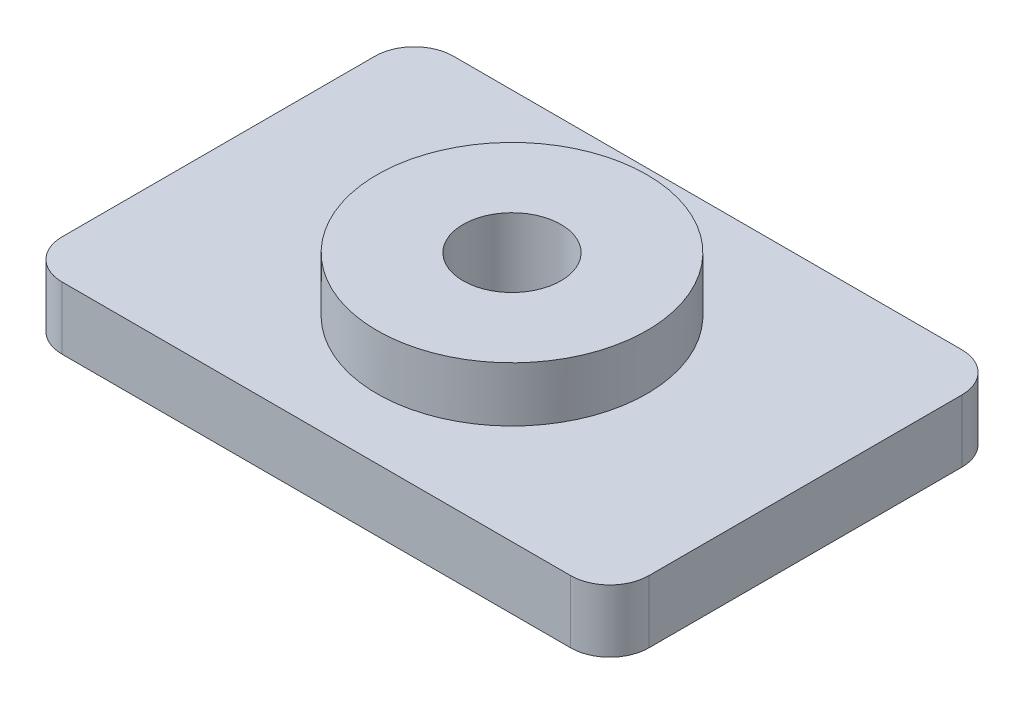
ISO-10303-21;
HEADER;
FILE_DESCRIPTION(('STEP AP214'),'2;1');
FILE_NAME('part.step','',(''),(''),'','','');
FILE_SCHEMA(('AUTOMOTIVE_DESIGN { 1 0 10303 214 1 1 1 1 }'));
ENDSEC;
DATA;
#1=APPLICATION_CONTEXT('core data for automotive mechanical design processes');
#2=APPLICATION_PROTOCOL_DEFINITION('international standard','automotive_design',2000,#1);
#3=PRODUCT_CONTEXT('',#1,'mechanical');
#4=PRODUCT('Part','Part','',(#3));
#5=PRODUCT_RELATED_PRODUCT_CATEGORY('part','',(#4));
#6=PRODUCT_DEFINITION_FORMATION('','',#4);
#7=PRODUCT_DEFINITION_CONTEXT('part definition',#1,'design');
#8=PRODUCT_DEFINITION('design','',#6,#7);
#9=PRODUCT_DEFINITION_SHAPE('','',#8);
#10=(LENGTH_UNIT() NAMED_UNIT(*) SI_UNIT(.MILLI.,.METRE.));
#11=(NAMED_UNIT(*) PLANE_ANGLE_UNIT() SI_UNIT($,.RADIAN.));
#12=(NAMED_UNIT(*) SI_UNIT($,.STERADIAN.) SOLID_ANGLE_UNIT());
#13=UNCERTAINTY_MEASURE_WITH_UNIT(LENGTH_MEASURE(1.E-05),#10,'distance_accuracy_value','');
#14=(GEOMETRIC_REPRESENTATION_CONTEXT(3) GLOBAL_UNCERTAINTY_ASSIGNED_CONTEXT((#13)) GLOBAL_UNIT_ASSIGNED_CONTEXT((#10,
#11,#12)) REPRESENTATION_CONTEXT('',''));
#15=CARTESIAN_POINT('',(0.,0.,0.));
#16=DIRECTION('',(0.,0.,1.));
#17=DIRECTION('',(1.,0.,0.));
#18=AXIS2_PLACEMENT_3D('',#15,#16,#17);
#19=CARTESIAN_POINT('',(14.,1.6,-9.));
#20=DIRECTION('',(0.,-1.,0.));
#21=DIRECTION('',(0.,0.,-1.));
#22=AXIS2_PLACEMENT_3D('',#19,#20,#21);
#23=PLANE('',#22);
#24=CARTESIAN_POINT('',(14.,1.6,-9.));
#25=DIRECTION('',(0.,1.,0.));
#26=DIRECTION('',(0.,0.,-1.));
#27=AXIS2_PLACEMENT_3D('',#24,#25,#26);
#28=CIRCLE('',#27,1.);
#29=CARTESIAN_POINT('',(15.,1.6,-8.99999999999999));
#30=VERTEX_POINT('',#29);
#31=CARTESIAN_POINT('',(14.,1.6,-10.));
#32=VERTEX_POINT('',#31);
#33=EDGE_CURVE('E176',#30,#32,#28,.T.);
#34=ORIENTED_EDGE('',*,*,#33,.T.);
#35=DIRECTION('',(-1.,0.,0.));
#36=VECTOR('',#35,1.);
#37=CARTESIAN_POINT('',(1.00000000000001,1.6,-10.));
#38=LINE('',#37,#36);
#39=CARTESIAN_POINT('',(1.00000000000001,1.6,-10.));
#40=VERTEX_POINT('',#39);
#41=EDGE_CURVE('E109',#32,#40,#38,.T.);
#42=ORIENTED_EDGE('',*,*,#41,.T.);
#43=CARTESIAN_POINT('',(1.,1.6,-9.));
#44=DIRECTION('',(0.,1.,0.));
#45=DIRECTION('',(0.,0.,-1.));
#46=AXIS2_PLACEMENT_3D('',#43,#44,#45);
#47=CIRCLE('',#46,1.);
#48=CARTESIAN_POINT('',(0.,1.6,-8.99999999999999));
#49=VERTEX_POINT('',#48);
#50=EDGE_CURVE('E214',#40,#49,#47,.T.);
#51=ORIENTED_EDGE('',*,*,#50,.T.);
#52=DIRECTION('',(0.,0.,1.));
#53=VECTOR('',#52,1.);
#54=CARTESIAN_POINT('',(0.,1.6,-1.00000000000001));
#55=LINE('',#54,#53);
#56=CARTESIAN_POINT('',(0.,1.6,-1.00000000000001));
#57=VERTEX_POINT('',#56);
#58=EDGE_CURVE('E212',#49,#57,#55,.T.);
#59=ORIENTED_EDGE('',*,*,#58,.T.);
#60=CARTESIAN_POINT('',(1.,1.6,-1.));
#61=DIRECTION('',(0.,1.,0.));
#62=DIRECTION('',(0.,0.,-1.));
#63=AXIS2_PLACEMENT_3D('',#60,#61,#62);
#64=CIRCLE('',#63,1.);
#65=CARTESIAN_POINT('',(1.00000000000001,1.6,0.));
#66=VERTEX_POINT('',#65);
#67=EDGE_CURVE('E131',#57,#66,#64,.T.);
#68=ORIENTED_EDGE('',*,*,#67,.T.);
#69=DIRECTION('',(1.,0.,0.));
#70=VECTOR('',#69,1.);
#71=CARTESIAN_POINT('',(1.00000000000001,1.6,0.));
#72=LINE('',#71,#70);
#73=CARTESIAN_POINT('',(14.,1.6,0.));
#74=VERTEX_POINT('',#73);
#75=EDGE_CURVE('E125',#66,#74,#72,.T.);
#76=ORIENTED_EDGE('',*,*,#75,.T.);
#77=CARTESIAN_POINT('',(14.,1.6,-1.));
#78=DIRECTION('',(0.,1.,0.));
#79=DIRECTION('',(0.,0.,1.));
#80=AXIS2_PLACEMENT_3D('',#77,#78,#79);
#81=CIRCLE('',#80,1.);
#82=CARTESIAN_POINT('',(15.,1.6,-1.00000000000001));
#83=VERTEX_POINT('',#82);
#84=EDGE_CURVE('E129',#74,#83,#81,.T.);
#85=ORIENTED_EDGE('',*,*,#84,.T.);
#86=DIRECTION('',(0.,0.,-1.));
#87=VECTOR('',#86,1.);
#88=CARTESIAN_POINT('',(15.,1.6,-1.00000000000001));
#89=LINE('',#88,#87);
#90=EDGE_CURVE('E59',#83,#30,#89,.T.);
#91=ORIENTED_EDGE('',*,*,#90,.T.);
#92=EDGE_LOOP('',(#34,#42,#51,#59,#68,#76,#85,#91));
#93=FACE_BOUND('',#92,.T.);
#94=CARTESIAN_POINT('',(7.5,1.6,-5.));
#95=DIRECTION('',(0.,-1.,0.));
#96=DIRECTION('',(0.,0.,-1.));
#97=AXIS2_PLACEMENT_3D('',#94,#95,#96);
#98=CIRCLE('',#97,3.45);
#99=CARTESIAN_POINT('',(7.5,1.6,-8.45));
#100=VERTEX_POINT('',#99);
#101=EDGE_CURVE('E11',#100,#100,#98,.F.);
#102=ORIENTED_EDGE('',*,*,#101,.F.);
#103=EDGE_LOOP('',(#102));
#104=FACE_BOUND('',#103,.T.);
#105=ADVANCED_FACE('F38',(#93,#104),#23,.F.);
#106=CARTESIAN_POINT('',(14.,1.6,-9.));
#107=DIRECTION('',(0.,-1.,0.));
#108=DIRECTION('',(0.,0.,-1.));
#109=AXIS2_PLACEMENT_3D('',#106,#107,#108);
#110=CYLINDRICAL_SURFACE('',#109,1.);
#111=CARTESIAN_POINT('',(14.,0.,-9.));
#112=DIRECTION('',(0.,1.,0.));
#113=DIRECTION('',(0.,0.,-1.));
#114=AXIS2_PLACEMENT_3D('',#111,#112,#113);
#115=CIRCLE('',#114,1.);
#116=CARTESIAN_POINT('',(15.,0.,-8.99999999999999));
#117=VERTEX_POINT('',#116);
#118=CARTESIAN_POINT('',(14.,0.,-10.));
#119=VERTEX_POINT('',#118);
#120=EDGE_CURVE('E154',#117,#119,#115,.T.);
#121=ORIENTED_EDGE('',*,*,#120,.T.);
#122=DIRECTION('',(0.,-1.,0.));
#123=VECTOR('',#122,1.);
#124=CARTESIAN_POINT('',(14.,1.6,-10.));
#125=LINE('',#124,#123);
#126=EDGE_CURVE('E48',#32,#119,#125,.T.);
#127=ORIENTED_EDGE('',*,*,#126,.F.);
#128=ORIENTED_EDGE('',*,*,#33,.F.);
#129=DIRECTION('',(0.,-1.,0.));
#130=VECTOR('',#129,1.);
#131=CARTESIAN_POINT('',(15.,1.6,-8.99999999999999));
#132=LINE('',#131,#130);
#133=EDGE_CURVE('E150',#30,#117,#132,.T.);
#134=ORIENTED_EDGE('',*,*,#133,.T.);
#135=EDGE_LOOP('',(#121,#127,#128,#134));
#136=FACE_BOUND('',#135,.T.);
#137=ADVANCED_FACE('F40',(#136),#110,.T.);
#138=CARTESIAN_POINT('',(1.00000000000001,1.6,-10.));
#139=DIRECTION('',(0.,0.,1.));
#140=DIRECTION('',(1.,0.,0.));
#141=AXIS2_PLACEMENT_3D('',#138,#139,#140);
#142=PLANE('',#141);
#143=DIRECTION('',(-1.,0.,0.));
#144=VECTOR('',#143,1.);
#145=CARTESIAN_POINT('',(1.00000000000001,0.,-10.));
#146=LINE('',#145,#144);
#147=CARTESIAN_POINT('',(1.00000000000001,0.,-10.));
#148=VERTEX_POINT('',#147);
#149=EDGE_CURVE('E157',#119,#148,#146,.T.);
#150=ORIENTED_EDGE('',*,*,#149,.T.);
#151=DIRECTION('',(0.,-1.,0.));
#152=VECTOR('',#151,1.);
#153=CARTESIAN_POINT('',(1.00000000000001,1.6,-10.));
#154=LINE('',#153,#152);
#155=EDGE_CURVE('E189',#40,#148,#154,.T.);
#156=ORIENTED_EDGE('',*,*,#155,.F.);
#157=ORIENTED_EDGE('',*,*,#41,.F.);
#158=ORIENTED_EDGE('',*,*,#126,.T.);
#159=EDGE_LOOP('',(#150,#156,#157,#158));
#160=FACE_BOUND('',#159,.T.);
#161=ADVANCED_FACE('F195',(#160),#142,.F.);
#162=CARTESIAN_POINT('',(1.,1.6,-9.));
#163=DIRECTION('',(0.,-1.,0.));
#164=DIRECTION('',(0.,0.,-1.));
#165=AXIS2_PLACEMENT_3D('',#162,#163,#164);
#166=CYLINDRICAL_SURFACE('',#165,1.);
#167=CARTESIAN_POINT('',(1.,0.,-9.));
#168=DIRECTION('',(0.,1.,0.));
#169=DIRECTION('',(0.,0.,-1.));
#170=AXIS2_PLACEMENT_3D('',#167,#168,#169);
#171=CIRCLE('',#170,1.);
#172=CARTESIAN_POINT('',(0.,0.,-8.99999999999999));
#173=VERTEX_POINT('',#172);
#174=EDGE_CURVE('E161',#148,#173,#171,.T.);
#175=ORIENTED_EDGE('',*,*,#174,.T.);
#176=DIRECTION('',(0.,-1.,0.));
#177=VECTOR('',#176,1.);
#178=CARTESIAN_POINT('',(0.,1.6,-8.99999999999999));
#179=LINE('',#178,#177);
#180=EDGE_CURVE('E186',#49,#173,#179,.T.);
#181=ORIENTED_EDGE('',*,*,#180,.F.);
#182=ORIENTED_EDGE('',*,*,#50,.F.);
#183=ORIENTED_EDGE('',*,*,#155,.T.);
#184=EDGE_LOOP('',(#175,#181,#182,#183));
#185=FACE_BOUND('',#184,.T.);
#186=ADVANCED_FACE('F206',(#185),#166,.T.);
#187=CARTESIAN_POINT('',(0.,1.6,-1.00000000000001));
#188=DIRECTION('',(1.,0.,0.));
#189=DIRECTION('',(0.,0.,-1.));
#190=AXIS2_PLACEMENT_3D('',#187,#188,#189);
#191=PLANE('',#190);
#192=DIRECTION('',(0.,0.,1.));
#193=VECTOR('',#192,1.);
#194=CARTESIAN_POINT('',(0.,0.,-1.00000000000001));
#195=LINE('',#194,#193);
#196=CARTESIAN_POINT('',(0.,0.,-1.00000000000001));
#197=VERTEX_POINT('',#196);
#198=EDGE_CURVE('E164',#173,#197,#195,.T.);
#199=ORIENTED_EDGE('',*,*,#198,.T.);
#200=DIRECTION('',(0.,-1.,0.));
#201=VECTOR('',#200,1.);
#202=CARTESIAN_POINT('',(0.,1.6,-1.00000000000001));
#203=LINE('',#202,#201);
#204=EDGE_CURVE('E182',#57,#197,#203,.T.);
#205=ORIENTED_EDGE('',*,*,#204,.F.);
#206=ORIENTED_EDGE('',*,*,#58,.F.);
#207=ORIENTED_EDGE('',*,*,#180,.T.);
#208=EDGE_LOOP('',(#199,#205,#206,#207));
#209=FACE_BOUND('',#208,.T.);
#210=ADVANCED_FACE('F210',(#209),#191,.F.);
#211=CARTESIAN_POINT('',(1.,1.6,-1.));
#212=DIRECTION('',(0.,-1.,0.));
#213=DIRECTION('',(0.,0.,-1.));
#214=AXIS2_PLACEMENT_3D('',#211,#212,#213);
#215=CYLINDRICAL_SURFACE('',#214,1.);
#216=CARTESIAN_POINT('',(1.,0.,-1.));
#217=DIRECTION('',(0.,1.,0.));
#218=DIRECTION('',(0.,0.,-1.));
#219=AXIS2_PLACEMENT_3D('',#216,#217,#218);
#220=CIRCLE('',#219,1.);
#221=CARTESIAN_POINT('',(1.00000000000001,0.,0.));
#222=VERTEX_POINT('',#221);
#223=EDGE_CURVE('E167',#197,#222,#220,.T.);
#224=ORIENTED_EDGE('',*,*,#223,.T.);
#225=DIRECTION('',(0.,-1.,0.));
#226=VECTOR('',#225,1.);
#227=CARTESIAN_POINT('',(1.00000000000001,1.6,0.));
#228=LINE('',#227,#226);
#229=EDGE_CURVE('E142',#66,#222,#228,.T.);
#230=ORIENTED_EDGE('',*,*,#229,.F.);
#231=ORIENTED_EDGE('',*,*,#67,.F.);
#232=ORIENTED_EDGE('',*,*,#204,.T.);
#233=EDGE_LOOP('',(#224,#230,#231,#232));
#234=FACE_BOUND('',#233,.T.);
#235=ADVANCED_FACE('F263',(#234),#215,.T.);
#236=CARTESIAN_POINT('',(1.00000000000001,1.6,0.));
#237=DIRECTION('',(0.,0.,-1.));
#238=DIRECTION('',(-1.,0.,0.));
#239=AXIS2_PLACEMENT_3D('',#236,#237,#238);
#240=PLANE('',#239);
#241=DIRECTION('',(1.,0.,0.));
#242=VECTOR('',#241,1.);
#243=CARTESIAN_POINT('',(1.00000000000001,0.,0.));
#244=LINE('',#243,#242);
#245=CARTESIAN_POINT('',(14.,0.,0.));
#246=VERTEX_POINT('',#245);
#247=EDGE_CURVE('E140',#222,#246,#244,.T.);
#248=ORIENTED_EDGE('',*,*,#247,.T.);
#249=DIRECTION('',(0.,-1.,0.));
#250=VECTOR('',#249,1.);
#251=CARTESIAN_POINT('',(14.,1.6,0.));
#252=LINE('',#251,#250);
#253=EDGE_CURVE('E137',#74,#246,#252,.T.);
#254=ORIENTED_EDGE('',*,*,#253,.F.);
#255=ORIENTED_EDGE('',*,*,#75,.F.);
#256=ORIENTED_EDGE('',*,*,#229,.T.);
#257=EDGE_LOOP('',(#248,#254,#255,#256));
#258=FACE_BOUND('',#257,.T.);
#259=ADVANCED_FACE('F138',(#258),#240,.F.);
#260=CARTESIAN_POINT('',(14.,1.6,-1.));
#261=DIRECTION('',(0.,-1.,0.));
#262=DIRECTION('',(0.,0.,-1.));
#263=AXIS2_PLACEMENT_3D('',#260,#261,#262);
#264=CYLINDRICAL_SURFACE('',#263,1.);
#265=CARTESIAN_POINT('',(14.,0.,-1.));
#266=DIRECTION('',(0.,1.,0.));
#267=DIRECTION('',(0.,0.,1.));
#268=AXIS2_PLACEMENT_3D('',#265,#266,#267);
#269=CIRCLE('',#268,1.);
#270=CARTESIAN_POINT('',(15.,0.,-1.00000000000001));
#271=VERTEX_POINT('',#270);
#272=EDGE_CURVE('E94',#246,#271,#269,.T.);
#273=ORIENTED_EDGE('',*,*,#272,.T.);
#274=DIRECTION('',(0.,-1.,0.));
#275=VECTOR('',#274,1.);
#276=CARTESIAN_POINT('',(15.,1.6,-1.00000000000001));
#277=LINE('',#276,#275);
#278=EDGE_CURVE('E143',#83,#271,#277,.T.);
#279=ORIENTED_EDGE('',*,*,#278,.F.);
#280=ORIENTED_EDGE('',*,*,#84,.F.);
#281=ORIENTED_EDGE('',*,*,#253,.T.);
#282=EDGE_LOOP('',(#273,#279,#280,#281));
#283=FACE_BOUND('',#282,.T.);
#284=ADVANCED_FACE('F145',(#283),#264,.T.);
#285=CARTESIAN_POINT('',(15.,1.6,-1.00000000000001));
#286=DIRECTION('',(-1.,0.,0.));
#287=DIRECTION('',(0.,0.,1.));
#288=AXIS2_PLACEMENT_3D('',#285,#286,#287);
#289=PLANE('',#288);
#290=DIRECTION('',(0.,0.,-1.));
#291=VECTOR('',#290,1.);
#292=CARTESIAN_POINT('',(15.,0.,-1.00000000000001));
#293=LINE('',#292,#291);
#294=EDGE_CURVE('E100',#271,#117,#293,.T.);
#295=ORIENTED_EDGE('',*,*,#294,.T.);
#296=ORIENTED_EDGE('',*,*,#133,.F.);
#297=ORIENTED_EDGE('',*,*,#90,.F.);
#298=ORIENTED_EDGE('',*,*,#278,.T.);
#299=EDGE_LOOP('',(#295,#296,#297,#298));
#300=FACE_BOUND('',#299,.T.);
#301=ADVANCED_FACE('F255',(#300),#289,.F.);
#302=CARTESIAN_POINT('',(14.,0.,-9.));
#303=DIRECTION('',(0.,-1.,0.));
#304=DIRECTION('',(0.,0.,-1.));
#305=AXIS2_PLACEMENT_3D('',#302,#303,#304);
#306=PLANE('',#305);
#307=CARTESIAN_POINT('',(7.5,0.,-5.));
#308=DIRECTION('',(0.,-1.,0.));
#309=DIRECTION('',(0.,0.,-1.));
#310=AXIS2_PLACEMENT_3D('',#307,#308,#309);
#311=CIRCLE('',#310,1.25);
#312=CARTESIAN_POINT('',(7.5,0.,-3.75));
#313=VERTEX_POINT('',#312);
#314=EDGE_CURVE('E226',#313,#313,#311,.F.);
#315=ORIENTED_EDGE('',*,*,#314,.T.);
#316=EDGE_LOOP('',(#315));
#317=FACE_BOUND('',#316,.T.);
#318=ORIENTED_EDGE('',*,*,#120,.F.);
#319=ORIENTED_EDGE('',*,*,#294,.F.);
#320=ORIENTED_EDGE('',*,*,#272,.F.);
#321=ORIENTED_EDGE('',*,*,#247,.F.);
#322=ORIENTED_EDGE('',*,*,#223,.F.);
#323=ORIENTED_EDGE('',*,*,#198,.F.);
#324=ORIENTED_EDGE('',*,*,#174,.F.);
#325=ORIENTED_EDGE('',*,*,#149,.F.);
#326=EDGE_LOOP('',(#318,#319,#320,#321,#322,#323,#324,#325));
#327=FACE_BOUND('',#326,.T.);
#328=ADVANCED_FACE('F200',(#317,#327),#306,.T.);
#329=CARTESIAN_POINT('',(7.5,3.,-5.));
#330=DIRECTION('',(0.,-1.,0.));
#331=DIRECTION('',(0.,0.,-1.));
#332=AXIS2_PLACEMENT_3D('',#329,#330,#331);
#333=CYLINDRICAL_SURFACE('',#332,3.45);
#334=CARTESIAN_POINT('',(7.5,3.,-5.));
#335=DIRECTION('',(0.,1.,0.));
#336=DIRECTION('',(0.,0.,1.));
#337=AXIS2_PLACEMENT_3D('',#334,#335,#336);
#338=CIRCLE('',#337,3.45);
#339=CARTESIAN_POINT('',(7.5,3.,-1.55));
#340=VERTEX_POINT('',#339);
#341=EDGE_CURVE('E158',#340,#340,#338,.T.);
#342=ORIENTED_EDGE('',*,*,#341,.F.);
#343=EDGE_LOOP('',(#342));
#344=FACE_BOUND('',#343,.T.);
#345=ORIENTED_EDGE('',*,*,#101,.T.);
#346=EDGE_LOOP('',(#345));
#347=FACE_BOUND('',#346,.T.);
#348=ADVANCED_FACE('F239',(#344,#347),#333,.T.);
#349=CARTESIAN_POINT('',(7.5,3.,-5.));
#350=DIRECTION('',(0.,1.,0.));
#351=DIRECTION('',(0.,0.,1.));
#352=AXIS2_PLACEMENT_3D('',#349,#350,#351);
#353=PLANE('',#352);
#354=CARTESIAN_POINT('',(7.5,3.,-5.));
#355=DIRECTION('',(0.,1.,0.));
#356=DIRECTION('',(0.,0.,1.));
#357=AXIS2_PLACEMENT_3D('',#354,#355,#356);
#358=CIRCLE('',#357,1.25);
#359=CARTESIAN_POINT('',(7.5,3.,-3.75));
#360=VERTEX_POINT('',#359);
#361=EDGE_CURVE('E225',#360,#360,#358,.T.);
#362=ORIENTED_EDGE('',*,*,#361,.F.);
#363=EDGE_LOOP('',(#362));
#364=FACE_BOUND('',#363,.T.);
#365=ORIENTED_EDGE('',*,*,#341,.T.);
#366=EDGE_LOOP('',(#365));
#367=FACE_BOUND('',#366,.T.);
#368=ADVANCED_FACE('F236',(#364,#367),#353,.T.);
#369=CARTESIAN_POINT('',(7.5,-0.00100000000000013,-5.));
#370=DIRECTION('',(0.,1.,0.));
#371=DIRECTION('',(0.,0.,1.));
#372=AXIS2_PLACEMENT_3D('',#369,#370,#371);
#373=CYLINDRICAL_SURFACE('',#372,1.25);
#374=CARTESIAN_POINT('',(7.5,0.,-3.75));
#375=CARTESIAN_POINT('',(7.5,0.03125,-3.75));
#376=CARTESIAN_POINT('',(7.5,0.0625,-3.75));
#377=CARTESIAN_POINT('',(7.5,0.125,-3.75));
#378=CARTESIAN_POINT('',(7.5,0.15625,-3.75));
#379=CARTESIAN_POINT('',(7.5,0.21875,-3.75));
#380=CARTESIAN_POINT('',(7.5,0.25,-3.75));
#381=CARTESIAN_POINT('',(7.5,0.3125,-3.75));
#382=CARTESIAN_POINT('',(7.5,0.34375,-3.75));
#383=CARTESIAN_POINT('',(7.5,0.40625,-3.75));
#384=CARTESIAN_POINT('',(7.5,0.4375,-3.75));
#385=CARTESIAN_POINT('',(7.5,0.5,-3.75));
#386=CARTESIAN_POINT('',(7.5,0.53125,-3.75));
#387=CARTESIAN_POINT('',(7.5,0.59375,-3.75));
#388=CARTESIAN_POINT('',(7.5,0.625,-3.75));
#389=CARTESIAN_POINT('',(7.5,0.6875,-3.75));
#390=CARTESIAN_POINT('',(7.5,0.71875,-3.75));
#391=CARTESIAN_POINT('',(7.5,0.78125,-3.75));
#392=CARTESIAN_POINT('',(7.5,0.8125,-3.75));
#393=CARTESIAN_POINT('',(7.5,0.875,-3.75));
#394=CARTESIAN_POINT('',(7.5,0.90625,-3.75));
#395=CARTESIAN_POINT('',(7.5,0.96875,-3.75));
#396=CARTESIAN_POINT('',(7.5,1.,-3.75));
#397=CARTESIAN_POINT('',(7.5,1.0625,-3.75));
#398=CARTESIAN_POINT('',(7.5,1.09375,-3.75));
#399=CARTESIAN_POINT('',(7.5,1.15625,-3.75));
#400=CARTESIAN_POINT('',(7.5,1.1875,-3.75));
#401=CARTESIAN_POINT('',(7.5,1.25,-3.75));
#402=CARTESIAN_POINT('',(7.5,1.28125,-3.75));
#403=CARTESIAN_POINT('',(7.5,1.34375,-3.75));
#404=CARTESIAN_POINT('',(7.5,1.375,-3.75));
#405=CARTESIAN_POINT('',(7.5,1.4375,-3.75));
#406=CARTESIAN_POINT('',(7.5,1.46875,-3.75));
#407=CARTESIAN_POINT('',(7.5,1.53125,-3.75));
#408=CARTESIAN_POINT('',(7.5,1.5625,-3.75));
#409=CARTESIAN_POINT('',(7.5,1.625,-3.75));
#410=CARTESIAN_POINT('',(7.5,1.65625,-3.75));
#411=CARTESIAN_POINT('',(7.5,1.71875,-3.75));
#412=CARTESIAN_POINT('',(7.5,1.75,-3.75));
#413=CARTESIAN_POINT('',(7.5,1.8125,-3.75));
#414=CARTESIAN_POINT('',(7.5,1.84375,-3.75));
#415=CARTESIAN_POINT('',(7.5,1.90625,-3.75));
#416=CARTESIAN_POINT('',(7.5,1.9375,-3.75));
#417=CARTESIAN_POINT('',(7.5,2.,-3.75));
#418=CARTESIAN_POINT('',(7.5,2.03125,-3.75));
#419=CARTESIAN_POINT('',(7.5,2.09375,-3.75));
#420=CARTESIAN_POINT('',(7.5,2.125,-3.75));
#421=CARTESIAN_POINT('',(7.5,2.1875,-3.75));
#422=CARTESIAN_POINT('',(7.5,2.21875,-3.75));
#423=CARTESIAN_POINT('',(7.5,2.28125,-3.75));
#424=CARTESIAN_POINT('',(7.5,2.3125,-3.75));
#425=CARTESIAN_POINT('',(7.5,2.375,-3.75));
#426=CARTESIAN_POINT('',(7.5,2.40625,-3.75));
#427=CARTESIAN_POINT('',(7.5,2.46875,-3.75));
#428=CARTESIAN_POINT('',(7.5,2.5,-3.75));
#429=CARTESIAN_POINT('',(7.5,2.5625,-3.75));
#430=CARTESIAN_POINT('',(7.5,2.59375,-3.75));
#431=CARTESIAN_POINT('',(7.5,2.65625,-3.75));
#432=CARTESIAN_POINT('',(7.5,2.6875,-3.75));
#433=CARTESIAN_POINT('',(7.5,2.75,-3.75));
#434=CARTESIAN_POINT('',(7.5,2.78125,-3.75));
#435=CARTESIAN_POINT('',(7.5,2.84375,-3.75));
#436=CARTESIAN_POINT('',(7.5,2.875,-3.75));
#437=CARTESIAN_POINT('',(7.5,2.9375,-3.75));
#438=CARTESIAN_POINT('',(7.5,2.96875,-3.75));
#439=CARTESIAN_POINT('',(7.5,3.,-3.75));
#440=B_SPLINE_CURVE_WITH_KNOTS('',3,(#374,#375,#376,#377,#378,#379,#380,#381,#382,#383,#384,
#385,#386,#387,#388,#389,#390,#391,#392,#393,#394,#395,#396,#397,#398,#399,#400,#401,#402,#403,
#404,#405,#406,#407,#408,#409,#410,#411,#412,#413,#414,#415,#416,#417,#418,#419,#420,#421,#422,
#423,#424,#425,#426,#427,#428,#429,#430,#431,#432,#433,#434,#435,#436,#437,#438,#439),
.UNSPECIFIED.,.F.,.F.,(4,2,2,2,2,2,2,2,2,2,2,2,2,2,2,2,2,2,2,2,2,2,2,2,2,2,2,2,2,2,2,2,4),(0.,
0.09375,0.1875,0.28125,0.375,0.46875,0.5625,0.65625,0.75,0.84375,0.9375,1.03125,1.125,1.21875,
1.3125,1.40625,1.5,1.59375,1.6875,1.78125,1.875,1.96875,2.0625,2.15625,2.25,2.34375,2.4375,
2.53125,2.625,2.71875,2.8125,2.90625,3.),.UNSPECIFIED.);
#441=EDGE_CURVE('BSEAM234',#313,#360,#440,.T.);
#442=ORIENTED_EDGE('',*,*,#314,.F.);
#443=ORIENTED_EDGE('',*,*,#361,.T.);
#444=ORIENTED_EDGE('',*,*,#441,.T.);
#445=ORIENTED_EDGE('',*,*,#441,.F.);
#446=EDGE_LOOP('',(#442,#444,#443,#445));
#447=FACE_BOUND('',#446,.T.);
#448=ADVANCED_FACE('F234',(#447),#373,.F.);
#449=CLOSED_SHELL('',(#105,#137,#161,#186,#210,#235,#259,#284,#301,#328,#348,#368,#448));
#450=MANIFOLD_SOLID_BREP('B2',#449);
#451=ADVANCED_BREP_SHAPE_REPRESENTATION('',(#18,#450),#14);
#452=SHAPE_DEFINITION_REPRESENTATION(#9,#451);
ENDSEC;
END-ISO-10303-21;
